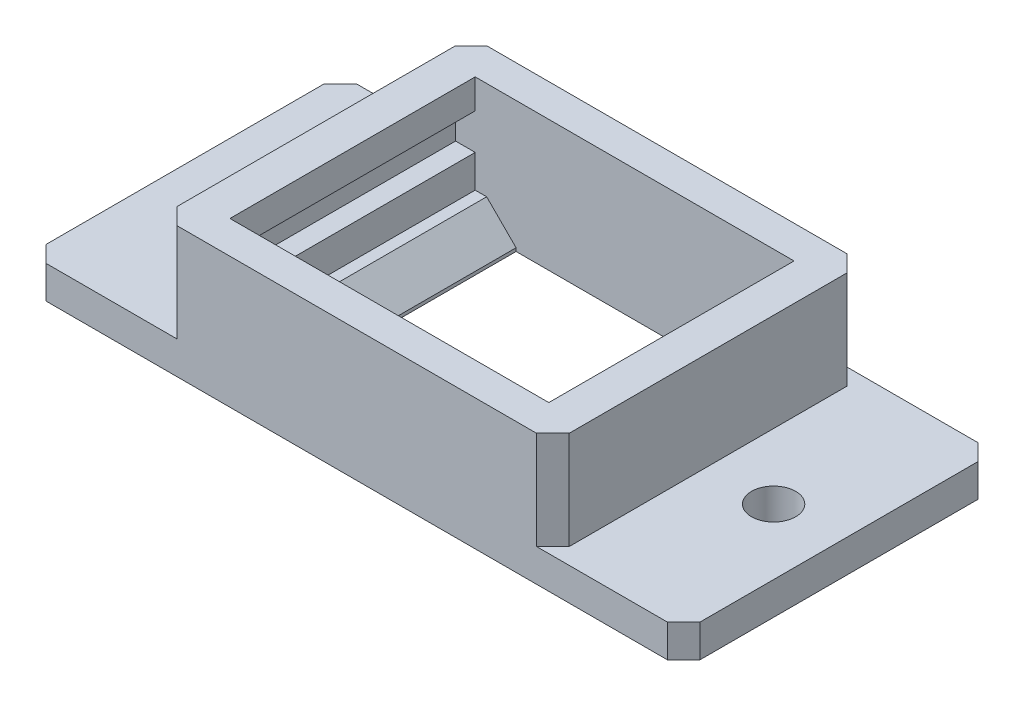
ISO-10303-21;
HEADER;
FILE_DESCRIPTION(('STEP AP214'),'2;1');
FILE_NAME('part.step','',(''),(''),'','','');
FILE_SCHEMA(('AUTOMOTIVE_DESIGN { 1 0 10303 214 1 1 1 1 }'));
ENDSEC;
DATA;
#1=APPLICATION_CONTEXT('core data for automotive mechanical design processes');
#2=APPLICATION_PROTOCOL_DEFINITION('international standard','automotive_design',2000,#1);
#3=PRODUCT_CONTEXT('',#1,'mechanical');
#4=PRODUCT('Part','Part','',(#3));
#5=PRODUCT_RELATED_PRODUCT_CATEGORY('part','',(#4));
#6=PRODUCT_DEFINITION_FORMATION('','',#4);
#7=PRODUCT_DEFINITION_CONTEXT('part definition',#1,'design');
#8=PRODUCT_DEFINITION('design','',#6,#7);
#9=PRODUCT_DEFINITION_SHAPE('','',#8);
#10=(LENGTH_UNIT() NAMED_UNIT(*) SI_UNIT(.MILLI.,.METRE.));
#11=(NAMED_UNIT(*) PLANE_ANGLE_UNIT() SI_UNIT($,.RADIAN.));
#12=(NAMED_UNIT(*) SI_UNIT($,.STERADIAN.) SOLID_ANGLE_UNIT());
#13=UNCERTAINTY_MEASURE_WITH_UNIT(LENGTH_MEASURE(1.E-05),#10,'distance_accuracy_value','');
#14=(GEOMETRIC_REPRESENTATION_CONTEXT(3) GLOBAL_UNCERTAINTY_ASSIGNED_CONTEXT((#13)) GLOBAL_UNIT_ASSIGNED_CONTEXT((#10,
#11,#12)) REPRESENTATION_CONTEXT('',''));
#15=CARTESIAN_POINT('',(0.,0.,0.));
#16=DIRECTION('',(0.,0.,1.));
#17=DIRECTION('',(1.,0.,0.));
#18=AXIS2_PLACEMENT_3D('',#15,#16,#17);
#19=CARTESIAN_POINT('',(9.75,2.,7.5));
#20=DIRECTION('',(1.,0.,0.));
#21=DIRECTION('',(0.,0.,-1.));
#22=AXIS2_PLACEMENT_3D('',#19,#20,#21);
#23=PLANE('',#22);
#24=DIRECTION('',(0.,0.,-1.));
#25=VECTOR('',#24,1.);
#26=CARTESIAN_POINT('',(9.75,4.,7.5));
#27=LINE('',#26,#25);
#28=CARTESIAN_POINT('',(9.75,4.,7.5));
#29=VERTEX_POINT('',#28);
#30=CARTESIAN_POINT('',(9.75,4.,-7.5));
#31=VERTEX_POINT('',#30);
#32=EDGE_CURVE('E260',#29,#31,#27,.T.);
#33=ORIENTED_EDGE('',*,*,#32,.T.);
#34=DIRECTION('',(0.,1.,0.));
#35=VECTOR('',#34,1.);
#36=CARTESIAN_POINT('',(9.75,2.,-7.5));
#37=LINE('',#36,#35);
#38=CARTESIAN_POINT('',(9.75,0.,-7.5));
#39=VERTEX_POINT('',#38);
#40=EDGE_CURVE('E461',#39,#31,#37,.T.);
#41=ORIENTED_EDGE('',*,*,#40,.F.);
#42=DIRECTION('',(0.,0.,-1.));
#43=VECTOR('',#42,1.);
#44=CARTESIAN_POINT('',(9.75,0.,0.));
#45=LINE('',#44,#43);
#46=CARTESIAN_POINT('',(9.75,0.,7.5));
#47=VERTEX_POINT('',#46);
#48=EDGE_CURVE('E319',#47,#39,#45,.T.);
#49=ORIENTED_EDGE('',*,*,#48,.F.);
#50=DIRECTION('',(0.,1.,0.));
#51=VECTOR('',#50,1.);
#52=CARTESIAN_POINT('',(9.75,2.,7.5));
#53=LINE('',#52,#51);
#54=EDGE_CURVE('E459',#47,#29,#53,.T.);
#55=ORIENTED_EDGE('',*,*,#54,.T.);
#56=EDGE_LOOP('',(#33,#41,#49,#55));
#57=FACE_BOUND('',#56,.T.);
#58=ADVANCED_FACE('F34',(#57),#23,.F.);
#59=DIRECTION('',(0.,0.,1.));
#60=VECTOR('',#59,1.);
#61=CARTESIAN_POINT('',(9.75,6.2,7.5));
#62=LINE('',#61,#60);
#63=CARTESIAN_POINT('',(9.75,6.2,-7.5));
#64=VERTEX_POINT('',#63);
#65=CARTESIAN_POINT('',(9.75,6.2,7.5));
#66=VERTEX_POINT('',#65);
#67=EDGE_CURVE('E263',#64,#66,#62,.T.);
#68=ORIENTED_EDGE('',*,*,#67,.T.);
#69=CARTESIAN_POINT('',(9.75,8.,7.5));
#70=VERTEX_POINT('',#69);
#71=EDGE_CURVE('E256',#66,#70,#53,.T.);
#72=ORIENTED_EDGE('',*,*,#71,.T.);
#73=DIRECTION('',(0.,0.,-1.));
#74=VECTOR('',#73,1.);
#75=CARTESIAN_POINT('',(9.75,8.,7.5));
#76=LINE('',#75,#74);
#77=CARTESIAN_POINT('',(9.75,8.,-7.5));
#78=VERTEX_POINT('',#77);
#79=EDGE_CURVE('E919',#70,#78,#76,.T.);
#80=ORIENTED_EDGE('',*,*,#79,.T.);
#81=EDGE_CURVE('E466',#64,#78,#37,.T.);
#82=ORIENTED_EDGE('',*,*,#81,.F.);
#83=EDGE_LOOP('',(#68,#72,#80,#82));
#84=FACE_BOUND('',#83,.T.);
#85=ADVANCED_FACE('F571',(#84),#23,.F.);
#86=CARTESIAN_POINT('',(-9.75,2.,7.5));
#87=DIRECTION('',(-1.,0.,0.));
#88=DIRECTION('',(0.,0.,1.));
#89=AXIS2_PLACEMENT_3D('',#86,#87,#88);
#90=PLANE('',#89);
#91=DIRECTION('',(0.,1.,0.));
#92=VECTOR('',#91,1.);
#93=CARTESIAN_POINT('',(-9.75,2.,7.5));
#94=LINE('',#93,#92);
#95=CARTESIAN_POINT('',(-9.75,6.2,7.5));
#96=VERTEX_POINT('',#95);
#97=CARTESIAN_POINT('',(-9.75,8.,7.5));
#98=VERTEX_POINT('',#97);
#99=EDGE_CURVE('E336',#96,#98,#94,.T.);
#100=ORIENTED_EDGE('',*,*,#99,.F.);
#101=DIRECTION('',(0.,0.,1.));
#102=VECTOR('',#101,1.);
#103=CARTESIAN_POINT('',(-9.75,6.2,7.5));
#104=LINE('',#103,#102);
#105=CARTESIAN_POINT('',(-9.75,6.2,-7.5));
#106=VERTEX_POINT('',#105);
#107=EDGE_CURVE('E283',#106,#96,#104,.T.);
#108=ORIENTED_EDGE('',*,*,#107,.F.);
#109=DIRECTION('',(0.,1.,0.));
#110=VECTOR('',#109,1.);
#111=CARTESIAN_POINT('',(-9.75,2.,-7.5));
#112=LINE('',#111,#110);
#113=CARTESIAN_POINT('',(-9.75,8.,-7.5));
#114=VERTEX_POINT('',#113);
#115=EDGE_CURVE('E465',#106,#114,#112,.T.);
#116=ORIENTED_EDGE('',*,*,#115,.T.);
#117=DIRECTION('',(0.,0.,1.));
#118=VECTOR('',#117,1.);
#119=CARTESIAN_POINT('',(-9.75,8.,7.5));
#120=LINE('',#119,#118);
#121=EDGE_CURVE('E328',#114,#98,#120,.T.);
#122=ORIENTED_EDGE('',*,*,#121,.T.);
#123=EDGE_LOOP('',(#100,#108,#116,#122));
#124=FACE_BOUND('',#123,.T.);
#125=ADVANCED_FACE('F576',(#124),#90,.F.);
#126=CARTESIAN_POINT('',(-20.,8.,9.50000000000001));
#127=DIRECTION('',(1.,0.,0.));
#128=DIRECTION('',(0.,0.,-1.));
#129=AXIS2_PLACEMENT_3D('',#126,#127,#128);
#130=PLANE('',#129);
#131=DIRECTION('',(0.,0.,1.));
#132=VECTOR('',#131,1.);
#133=CARTESIAN_POINT('',(-20.,0.,9.50000000000001));
#134=LINE('',#133,#132);
#135=CARTESIAN_POINT('',(-20.,0.,-8.49999999999998));
#136=VERTEX_POINT('',#135);
#137=CARTESIAN_POINT('',(-20.,0.,8.5));
#138=VERTEX_POINT('',#137);
#139=EDGE_CURVE('E415',#136,#138,#134,.T.);
#140=ORIENTED_EDGE('',*,*,#139,.T.);
#141=DIRECTION('',(0.,1.,0.));
#142=VECTOR('',#141,1.);
#143=CARTESIAN_POINT('',(-20.,8.,8.5));
#144=LINE('',#143,#142);
#145=CARTESIAN_POINT('',(-20.,2.,8.5));
#146=VERTEX_POINT('',#145);
#147=EDGE_CURVE('E49',#138,#146,#144,.T.);
#148=ORIENTED_EDGE('',*,*,#147,.T.);
#149=DIRECTION('',(0.,0.,1.));
#150=VECTOR('',#149,1.);
#151=CARTESIAN_POINT('',(-20.,2.,9.50000000000001));
#152=LINE('',#151,#150);
#153=CARTESIAN_POINT('',(-20.,2.,-8.49999999999998));
#154=VERTEX_POINT('',#153);
#155=EDGE_CURVE('E416',#154,#146,#152,.T.);
#156=ORIENTED_EDGE('',*,*,#155,.F.);
#157=DIRECTION('',(0.,-1.,0.));
#158=VECTOR('',#157,1.);
#159=CARTESIAN_POINT('',(-20.,8.,-8.49999999999999));
#160=LINE('',#159,#158);
#161=EDGE_CURVE('E409',#154,#136,#160,.T.);
#162=ORIENTED_EDGE('',*,*,#161,.T.);
#163=EDGE_LOOP('',(#140,#148,#156,#162));
#164=FACE_BOUND('',#163,.T.);
#165=ADVANCED_FACE('F414',(#164),#130,.F.);
#166=CARTESIAN_POINT('',(20.,8.,9.5));
#167=DIRECTION('',(0.,0.,-1.));
#168=DIRECTION('',(-1.,0.,0.));
#169=AXIS2_PLACEMENT_3D('',#166,#167,#168);
#170=PLANE('',#169);
#171=DIRECTION('',(1.,0.,0.));
#172=VECTOR('',#171,1.);
#173=CARTESIAN_POINT('',(20.,0.,9.5));
#174=LINE('',#173,#172);
#175=CARTESIAN_POINT('',(-19.,0.,9.50000000000001));
#176=VERTEX_POINT('',#175);
#177=CARTESIAN_POINT('',(19.,0.,9.5));
#178=VERTEX_POINT('',#177);
#179=EDGE_CURVE('E424',#176,#178,#174,.T.);
#180=ORIENTED_EDGE('',*,*,#179,.T.);
#181=DIRECTION('',(0.,1.,0.));
#182=VECTOR('',#181,1.);
#183=CARTESIAN_POINT('',(19.,8.,9.5));
#184=LINE('',#183,#182);
#185=CARTESIAN_POINT('',(19.,2.,9.5));
#186=VERTEX_POINT('',#185);
#187=EDGE_CURVE('E398',#178,#186,#184,.T.);
#188=ORIENTED_EDGE('',*,*,#187,.T.);
#189=DIRECTION('',(1.,0.,0.));
#190=VECTOR('',#189,1.);
#191=CARTESIAN_POINT('',(20.,2.,9.5));
#192=LINE('',#191,#190);
#193=CARTESIAN_POINT('',(11.,2.,9.5));
#194=VERTEX_POINT('',#193);
#195=EDGE_CURVE('E425',#194,#186,#192,.T.);
#196=ORIENTED_EDGE('',*,*,#195,.F.);
#197=DIRECTION('',(0.,1.,0.));
#198=VECTOR('',#197,1.);
#199=CARTESIAN_POINT('',(11.,8.,9.5));
#200=LINE('',#199,#198);
#201=CARTESIAN_POINT('',(11.,8.,9.5));
#202=VERTEX_POINT('',#201);
#203=EDGE_CURVE('E369',#194,#202,#200,.T.);
#204=ORIENTED_EDGE('',*,*,#203,.T.);
#205=DIRECTION('',(1.,0.,0.));
#206=VECTOR('',#205,1.);
#207=CARTESIAN_POINT('',(20.,8.,9.5));
#208=LINE('',#207,#206);
#209=CARTESIAN_POINT('',(-11.,8.,9.5));
#210=VERTEX_POINT('',#209);
#211=EDGE_CURVE('E442',#210,#202,#208,.T.);
#212=ORIENTED_EDGE('',*,*,#211,.F.);
#213=DIRECTION('',(0.,-1.,0.));
#214=VECTOR('',#213,1.);
#215=CARTESIAN_POINT('',(-11.,2.,9.5));
#216=LINE('',#215,#214);
#217=CARTESIAN_POINT('',(-11.,2.,9.5));
#218=VERTEX_POINT('',#217);
#219=EDGE_CURVE('E366',#210,#218,#216,.T.);
#220=ORIENTED_EDGE('',*,*,#219,.T.);
#221=CARTESIAN_POINT('',(-19.,2.,9.50000000000001));
#222=VERTEX_POINT('',#221);
#223=EDGE_CURVE('E433',#222,#218,#192,.T.);
#224=ORIENTED_EDGE('',*,*,#223,.F.);
#225=DIRECTION('',(0.,-1.,0.));
#226=VECTOR('',#225,1.);
#227=CARTESIAN_POINT('',(-19.,8.,9.50000000000001));
#228=LINE('',#227,#226);
#229=EDGE_CURVE('E395',#222,#176,#228,.T.);
#230=ORIENTED_EDGE('',*,*,#229,.T.);
#231=EDGE_LOOP('',(#180,#188,#196,#204,#212,#220,#224,#230));
#232=FACE_BOUND('',#231,.T.);
#233=ADVANCED_FACE('F542',(#232),#170,.F.);
#234=CARTESIAN_POINT('',(20.,8.,9.5));
#235=DIRECTION('',(-1.,0.,0.));
#236=DIRECTION('',(0.,0.,1.));
#237=AXIS2_PLACEMENT_3D('',#234,#235,#236);
#238=PLANE('',#237);
#239=DIRECTION('',(0.,0.,-1.));
#240=VECTOR('',#239,1.);
#241=CARTESIAN_POINT('',(20.,2.,9.5));
#242=LINE('',#241,#240);
#243=CARTESIAN_POINT('',(20.,2.,8.49999999999999));
#244=VERTEX_POINT('',#243);
#245=CARTESIAN_POINT('',(20.,2.,-8.49999999999999));
#246=VERTEX_POINT('',#245);
#247=EDGE_CURVE('E431',#244,#246,#242,.T.);
#248=ORIENTED_EDGE('',*,*,#247,.F.);
#249=DIRECTION('',(0.,-1.,0.));
#250=VECTOR('',#249,1.);
#251=CARTESIAN_POINT('',(20.,8.,8.49999999999999));
#252=LINE('',#251,#250);
#253=CARTESIAN_POINT('',(20.,0.,8.49999999999999));
#254=VERTEX_POINT('',#253);
#255=EDGE_CURVE('E384',#244,#254,#252,.T.);
#256=ORIENTED_EDGE('',*,*,#255,.T.);
#257=DIRECTION('',(0.,0.,-1.));
#258=VECTOR('',#257,1.);
#259=CARTESIAN_POINT('',(20.,0.,9.5));
#260=LINE('',#259,#258);
#261=CARTESIAN_POINT('',(20.,0.,-8.49999999999999));
#262=VERTEX_POINT('',#261);
#263=EDGE_CURVE('E428',#254,#262,#260,.T.);
#264=ORIENTED_EDGE('',*,*,#263,.T.);
#265=DIRECTION('',(0.,1.,0.));
#266=VECTOR('',#265,1.);
#267=CARTESIAN_POINT('',(20.,8.,-8.49999999999999));
#268=LINE('',#267,#266);
#269=EDGE_CURVE('E382',#262,#246,#268,.T.);
#270=ORIENTED_EDGE('',*,*,#269,.T.);
#271=EDGE_LOOP('',(#248,#256,#264,#270));
#272=FACE_BOUND('',#271,.T.);
#273=ADVANCED_FACE('F517',(#272),#238,.F.);
#274=CARTESIAN_POINT('',(20.,8.,-9.5));
#275=DIRECTION('',(0.,0.,1.));
#276=DIRECTION('',(1.,0.,0.));
#277=AXIS2_PLACEMENT_3D('',#274,#275,#276);
#278=PLANE('',#277);
#279=DIRECTION('',(-1.,0.,0.));
#280=VECTOR('',#279,1.);
#281=CARTESIAN_POINT('',(20.,2.,-9.5));
#282=LINE('',#281,#280);
#283=CARTESIAN_POINT('',(19.,2.,-9.5));
#284=VERTEX_POINT('',#283);
#285=CARTESIAN_POINT('',(11.,2.,-9.5));
#286=VERTEX_POINT('',#285);
#287=EDGE_CURVE('E443',#284,#286,#282,.T.);
#288=ORIENTED_EDGE('',*,*,#287,.F.);
#289=DIRECTION('',(0.,-1.,0.));
#290=VECTOR('',#289,1.);
#291=CARTESIAN_POINT('',(19.,8.,-9.5));
#292=LINE('',#291,#290);
#293=CARTESIAN_POINT('',(19.,0.,-9.5));
#294=VERTEX_POINT('',#293);
#295=EDGE_CURVE('E406',#284,#294,#292,.T.);
#296=ORIENTED_EDGE('',*,*,#295,.T.);
#297=DIRECTION('',(-1.,0.,0.));
#298=VECTOR('',#297,1.);
#299=CARTESIAN_POINT('',(20.,0.,-9.5));
#300=LINE('',#299,#298);
#301=CARTESIAN_POINT('',(-19.,0.,-9.49999999999999));
#302=VERTEX_POINT('',#301);
#303=EDGE_CURVE('E440',#294,#302,#300,.T.);
#304=ORIENTED_EDGE('',*,*,#303,.T.);
#305=DIRECTION('',(0.,1.,0.));
#306=VECTOR('',#305,1.);
#307=CARTESIAN_POINT('',(-19.,8.,-9.49999999999999));
#308=LINE('',#307,#306);
#309=CARTESIAN_POINT('',(-19.,2.,-9.5));
#310=VERTEX_POINT('',#309);
#311=EDGE_CURVE('E404',#302,#310,#308,.T.);
#312=ORIENTED_EDGE('',*,*,#311,.T.);
#313=CARTESIAN_POINT('',(-11.,2.,-9.5));
#314=VERTEX_POINT('',#313);
#315=EDGE_CURVE('E446',#314,#310,#282,.T.);
#316=ORIENTED_EDGE('',*,*,#315,.F.);
#317=DIRECTION('',(0.,1.,0.));
#318=VECTOR('',#317,1.);
#319=CARTESIAN_POINT('',(-11.,8.,-9.5));
#320=LINE('',#319,#318);
#321=CARTESIAN_POINT('',(-11.,8.,-9.49999999999999));
#322=VERTEX_POINT('',#321);
#323=EDGE_CURVE('E345',#314,#322,#320,.T.);
#324=ORIENTED_EDGE('',*,*,#323,.T.);
#325=DIRECTION('',(-1.,0.,0.));
#326=VECTOR('',#325,1.);
#327=CARTESIAN_POINT('',(20.,8.,-9.5));
#328=LINE('',#327,#326);
#329=CARTESIAN_POINT('',(11.,8.,-9.5));
#330=VERTEX_POINT('',#329);
#331=EDGE_CURVE('E435',#330,#322,#328,.T.);
#332=ORIENTED_EDGE('',*,*,#331,.F.);
#333=DIRECTION('',(0.,-1.,0.));
#334=VECTOR('',#333,1.);
#335=CARTESIAN_POINT('',(11.,2.,-9.5));
#336=LINE('',#335,#334);
#337=EDGE_CURVE('E342',#330,#286,#336,.T.);
#338=ORIENTED_EDGE('',*,*,#337,.T.);
#339=EDGE_LOOP('',(#288,#296,#304,#312,#316,#324,#332,#338));
#340=FACE_BOUND('',#339,.T.);
#341=ADVANCED_FACE('F511',(#340),#278,.F.);
#342=CARTESIAN_POINT('',(0.,8.,0.));
#343=DIRECTION('',(0.,1.,0.));
#344=DIRECTION('',(0.,0.,1.));
#345=AXIS2_PLACEMENT_3D('',#342,#343,#344);
#346=PLANE('',#345);
#347=ORIENTED_EDGE('',*,*,#121,.F.);
#348=DIRECTION('',(-1.,0.,0.));
#349=VECTOR('',#348,1.);
#350=CARTESIAN_POINT('',(9.75,8.,-7.5));
#351=LINE('',#350,#349);
#352=EDGE_CURVE('E309',#78,#114,#351,.T.);
#353=ORIENTED_EDGE('',*,*,#352,.F.);
#354=ORIENTED_EDGE('',*,*,#79,.F.);
#355=DIRECTION('',(1.,0.,0.));
#356=VECTOR('',#355,1.);
#357=CARTESIAN_POINT('',(9.75,8.,7.5));
#358=LINE('',#357,#356);
#359=EDGE_CURVE('E620',#98,#70,#358,.T.);
#360=ORIENTED_EDGE('',*,*,#359,.F.);
#361=EDGE_LOOP('',(#347,#353,#354,#360));
#362=FACE_BOUND('',#361,.T.);
#363=ORIENTED_EDGE('',*,*,#331,.T.);
#364=DIRECTION('',(-0.707106781186544,0.,0.707106781186551));
#365=VECTOR('',#364,1.);
#366=CARTESIAN_POINT('',(-10.2500000000001,8.,-10.25));
#367=LINE('',#366,#365);
#368=CARTESIAN_POINT('',(-12.,8.,-8.49999999999999));
#369=VERTEX_POINT('',#368);
#370=EDGE_CURVE('E354',#322,#369,#367,.T.);
#371=ORIENTED_EDGE('',*,*,#370,.T.);
#372=DIRECTION('',(0.,0.,1.));
#373=VECTOR('',#372,1.);
#374=CARTESIAN_POINT('',(-12.,8.,9.5));
#375=LINE('',#374,#373);
#376=CARTESIAN_POINT('',(-12.,8.,8.5));
#377=VERTEX_POINT('',#376);
#378=EDGE_CURVE('E491',#369,#377,#375,.T.);
#379=ORIENTED_EDGE('',*,*,#378,.T.);
#380=DIRECTION('',(0.707106781186548,0.,0.707106781186548));
#381=VECTOR('',#380,1.);
#382=CARTESIAN_POINT('',(-10.25,8.,10.25));
#383=LINE('',#382,#381);
#384=EDGE_CURVE('E348',#377,#210,#383,.T.);
#385=ORIENTED_EDGE('',*,*,#384,.T.);
#386=ORIENTED_EDGE('',*,*,#211,.T.);
#387=DIRECTION('',(0.707106781186548,0.,-0.707106781186548));
#388=VECTOR('',#387,1.);
#389=CARTESIAN_POINT('',(10.25,8.,10.25));
#390=LINE('',#389,#388);
#391=CARTESIAN_POINT('',(12.,8.,8.50000000000001));
#392=VERTEX_POINT('',#391);
#393=EDGE_CURVE('E350',#202,#392,#390,.T.);
#394=ORIENTED_EDGE('',*,*,#393,.T.);
#395=DIRECTION('',(0.,0.,-1.));
#396=VECTOR('',#395,1.);
#397=CARTESIAN_POINT('',(12.,8.,9.5));
#398=LINE('',#397,#396);
#399=CARTESIAN_POINT('',(12.,8.,-8.49999999999998));
#400=VERTEX_POINT('',#399);
#401=EDGE_CURVE('E488',#392,#400,#398,.T.);
#402=ORIENTED_EDGE('',*,*,#401,.T.);
#403=DIRECTION('',(-0.707106781186548,0.,-0.707106781186548));
#404=VECTOR('',#403,1.);
#405=CARTESIAN_POINT('',(10.25,8.,-10.25));
#406=LINE('',#405,#404);
#407=EDGE_CURVE('E352',#400,#330,#406,.T.);
#408=ORIENTED_EDGE('',*,*,#407,.T.);
#409=EDGE_LOOP('',(#363,#371,#379,#385,#386,#394,#402,#408));
#410=FACE_BOUND('',#409,.T.);
#411=ADVANCED_FACE('F557',(#362,#410),#346,.T.);
#412=CARTESIAN_POINT('',(0.,0.,0.));
#413=DIRECTION('',(0.,1.,0.));
#414=DIRECTION('',(0.,0.,1.));
#415=AXIS2_PLACEMENT_3D('',#412,#413,#414);
#416=PLANE('',#415);
#417=CARTESIAN_POINT('',(16.,0.,0.));
#418=DIRECTION('',(0.,1.,0.));
#419=DIRECTION('',(0.,0.,1.));
#420=AXIS2_PLACEMENT_3D('',#417,#418,#419);
#421=CIRCLE('',#420,1.35);
#422=CARTESIAN_POINT('',(16.,0.,1.35));
#423=VERTEX_POINT('',#422);
#424=EDGE_CURVE('E670',#423,#423,#421,.T.);
#425=ORIENTED_EDGE('',*,*,#424,.T.);
#426=EDGE_LOOP('',(#425));
#427=FACE_BOUND('',#426,.T.);
#428=CARTESIAN_POINT('',(-16.,0.,0.));
#429=DIRECTION('',(0.,1.,0.));
#430=DIRECTION('',(0.,0.,1.));
#431=AXIS2_PLACEMENT_3D('',#428,#429,#430);
#432=CIRCLE('',#431,1.35);
#433=CARTESIAN_POINT('',(-16.,0.,1.35));
#434=VERTEX_POINT('',#433);
#435=EDGE_CURVE('E271',#434,#434,#432,.T.);
#436=ORIENTED_EDGE('',*,*,#435,.T.);
#437=EDGE_LOOP('',(#436));
#438=FACE_BOUND('',#437,.T.);
#439=DIRECTION('',(1.,0.,0.));
#440=VECTOR('',#439,1.);
#441=CARTESIAN_POINT('',(0.,0.,7.5));
#442=LINE('',#441,#440);
#443=CARTESIAN_POINT('',(-7.25,0.,7.5));
#444=VERTEX_POINT('',#443);
#445=EDGE_CURVE('E451',#444,#47,#442,.T.);
#446=ORIENTED_EDGE('',*,*,#445,.T.);
#447=ORIENTED_EDGE('',*,*,#48,.T.);
#448=DIRECTION('',(-1.,0.,0.));
#449=VECTOR('',#448,1.);
#450=CARTESIAN_POINT('',(0.,0.,-7.5));
#451=LINE('',#450,#449);
#452=CARTESIAN_POINT('',(-7.25,0.,-7.5));
#453=VERTEX_POINT('',#452);
#454=EDGE_CURVE('E445',#39,#453,#451,.T.);
#455=ORIENTED_EDGE('',*,*,#454,.T.);
#456=DIRECTION('',(0.,0.,1.));
#457=VECTOR('',#456,1.);
#458=CARTESIAN_POINT('',(-7.25,0.,0.));
#459=LINE('',#458,#457);
#460=EDGE_CURVE('E449',#453,#444,#459,.T.);
#461=ORIENTED_EDGE('',*,*,#460,.T.);
#462=EDGE_LOOP('',(#446,#447,#455,#461));
#463=FACE_BOUND('',#462,.T.);
#464=ORIENTED_EDGE('',*,*,#263,.F.);
#465=DIRECTION('',(0.707106781186548,0.,-0.707106781186548));
#466=VECTOR('',#465,1.);
#467=CARTESIAN_POINT('',(20.,0.,8.49999999999999));
#468=LINE('',#467,#466);
#469=EDGE_CURVE('E393',#254,#178,#468,.F.);
#470=ORIENTED_EDGE('',*,*,#469,.T.);
#471=ORIENTED_EDGE('',*,*,#179,.F.);
#472=DIRECTION('',(0.707106781186548,0.,0.707106781186548));
#473=VECTOR('',#472,1.);
#474=CARTESIAN_POINT('',(-19.,0.,9.50000000000001));
#475=LINE('',#474,#473);
#476=EDGE_CURVE('E389',#176,#138,#475,.F.);
#477=ORIENTED_EDGE('',*,*,#476,.T.);
#478=ORIENTED_EDGE('',*,*,#139,.F.);
#479=DIRECTION('',(-0.707106781186548,0.,0.707106781186548));
#480=VECTOR('',#479,1.);
#481=CARTESIAN_POINT('',(-20.,0.,-8.49999999999999));
#482=LINE('',#481,#480);
#483=EDGE_CURVE('E387',#136,#302,#482,.F.);
#484=ORIENTED_EDGE('',*,*,#483,.T.);
#485=ORIENTED_EDGE('',*,*,#303,.F.);
#486=DIRECTION('',(-0.707106781186548,0.,-0.707106781186548));
#487=VECTOR('',#486,1.);
#488=CARTESIAN_POINT('',(19.,0.,-9.5));
#489=LINE('',#488,#487);
#490=EDGE_CURVE('E391',#294,#262,#489,.F.);
#491=ORIENTED_EDGE('',*,*,#490,.T.);
#492=EDGE_LOOP('',(#464,#470,#471,#477,#478,#484,#485,#491));
#493=FACE_BOUND('',#492,.T.);
#494=ADVANCED_FACE('F420',(#427,#438,#463,#493),#416,.F.);
#495=CARTESIAN_POINT('',(12.,2.,9.5));
#496=DIRECTION('',(1.,0.,0.));
#497=DIRECTION('',(0.,0.,-1.));
#498=AXIS2_PLACEMENT_3D('',#495,#496,#497);
#499=PLANE('',#498);
#500=DIRECTION('',(0.,0.,-1.));
#501=VECTOR('',#500,1.);
#502=CARTESIAN_POINT('',(12.,2.,9.5));
#503=LINE('',#502,#501);
#504=CARTESIAN_POINT('',(12.,2.,8.50000000000001));
#505=VERTEX_POINT('',#504);
#506=CARTESIAN_POINT('',(12.,2.,-8.49999999999999));
#507=VERTEX_POINT('',#506);
#508=EDGE_CURVE('E487',#505,#507,#503,.T.);
#509=ORIENTED_EDGE('',*,*,#508,.T.);
#510=DIRECTION('',(0.,1.,0.));
#511=VECTOR('',#510,1.);
#512=CARTESIAN_POINT('',(12.,8.,-8.49999999999999));
#513=LINE('',#512,#511);
#514=EDGE_CURVE('E363',#507,#400,#513,.T.);
#515=ORIENTED_EDGE('',*,*,#514,.T.);
#516=ORIENTED_EDGE('',*,*,#401,.F.);
#517=DIRECTION('',(0.,-1.,0.));
#518=VECTOR('',#517,1.);
#519=CARTESIAN_POINT('',(12.,2.,8.50000000000001));
#520=LINE('',#519,#518);
#521=EDGE_CURVE('E361',#392,#505,#520,.T.);
#522=ORIENTED_EDGE('',*,*,#521,.T.);
#523=EDGE_LOOP('',(#509,#515,#516,#522));
#524=FACE_BOUND('',#523,.T.);
#525=ADVANCED_FACE('F531',(#524),#499,.T.);
#526=CARTESIAN_POINT('',(0.,2.,0.));
#527=DIRECTION('',(0.,1.,0.));
#528=DIRECTION('',(0.,0.,1.));
#529=AXIS2_PLACEMENT_3D('',#526,#527,#528);
#530=PLANE('',#529);
#531=CARTESIAN_POINT('',(16.,2.,0.));
#532=DIRECTION('',(0.,1.,0.));
#533=DIRECTION('',(0.,0.,1.));
#534=AXIS2_PLACEMENT_3D('',#531,#532,#533);
#535=CIRCLE('',#534,1.35);
#536=CARTESIAN_POINT('',(16.,2.,1.35));
#537=VERTEX_POINT('',#536);
#538=EDGE_CURVE('E673',#537,#537,#535,.T.);
#539=ORIENTED_EDGE('',*,*,#538,.F.);
#540=EDGE_LOOP('',(#539));
#541=FACE_BOUND('',#540,.T.);
#542=ORIENTED_EDGE('',*,*,#195,.T.);
#543=DIRECTION('',(-0.707106781186548,0.,0.707106781186548));
#544=VECTOR('',#543,1.);
#545=CARTESIAN_POINT('',(14.25,2.,14.25));
#546=LINE('',#545,#544);
#547=EDGE_CURVE('E402',#186,#244,#546,.F.);
#548=ORIENTED_EDGE('',*,*,#547,.T.);
#549=ORIENTED_EDGE('',*,*,#247,.T.);
#550=DIRECTION('',(0.707106781186548,0.,0.707106781186548));
#551=VECTOR('',#550,1.);
#552=CARTESIAN_POINT('',(14.25,2.,-14.25));
#553=LINE('',#552,#551);
#554=EDGE_CURVE('E400',#246,#284,#553,.F.);
#555=ORIENTED_EDGE('',*,*,#554,.T.);
#556=ORIENTED_EDGE('',*,*,#287,.T.);
#557=DIRECTION('',(0.707106781186548,0.,0.707106781186548));
#558=VECTOR('',#557,1.);
#559=CARTESIAN_POINT('',(12.,2.,-8.49999999999999));
#560=LINE('',#559,#558);
#561=EDGE_CURVE('E375',#286,#507,#560,.T.);
#562=ORIENTED_EDGE('',*,*,#561,.T.);
#563=ORIENTED_EDGE('',*,*,#508,.F.);
#564=DIRECTION('',(-0.707106781186548,0.,0.707106781186548));
#565=VECTOR('',#564,1.);
#566=CARTESIAN_POINT('',(11.,2.,9.5));
#567=LINE('',#566,#565);
#568=EDGE_CURVE('E377',#505,#194,#567,.T.);
#569=ORIENTED_EDGE('',*,*,#568,.T.);
#570=EDGE_LOOP('',(#542,#548,#549,#555,#556,#562,#563,#569));
#571=FACE_BOUND('',#570,.T.);
#572=ADVANCED_FACE('F522',(#541,#571),#530,.T.);
#573=CARTESIAN_POINT('',(-16.,2.,0.));
#574=DIRECTION('',(0.,1.,0.));
#575=DIRECTION('',(0.,0.,1.));
#576=AXIS2_PLACEMENT_3D('',#573,#574,#575);
#577=CIRCLE('',#576,1.35);
#578=CARTESIAN_POINT('',(-16.,2.,1.35));
#579=VERTEX_POINT('',#578);
#580=EDGE_CURVE('E266',#579,#579,#577,.T.);
#581=ORIENTED_EDGE('',*,*,#580,.F.);
#582=EDGE_LOOP('',(#581));
#583=FACE_BOUND('',#582,.T.);
#584=ORIENTED_EDGE('',*,*,#155,.T.);
#585=DIRECTION('',(-0.707106781186548,0.,-0.707106781186548));
#586=VECTOR('',#585,1.);
#587=CARTESIAN_POINT('',(-14.25,2.,14.25));
#588=LINE('',#587,#586);
#589=EDGE_CURVE('E11',#146,#222,#588,.F.);
#590=ORIENTED_EDGE('',*,*,#589,.T.);
#591=ORIENTED_EDGE('',*,*,#223,.T.);
#592=DIRECTION('',(-0.707106781186548,0.,-0.707106781186548));
#593=VECTOR('',#592,1.);
#594=CARTESIAN_POINT('',(-12.,2.,8.5));
#595=LINE('',#594,#593);
#596=CARTESIAN_POINT('',(-12.,2.,8.5));
#597=VERTEX_POINT('',#596);
#598=EDGE_CURVE('E380',#218,#597,#595,.T.);
#599=ORIENTED_EDGE('',*,*,#598,.T.);
#600=DIRECTION('',(0.,0.,1.));
#601=VECTOR('',#600,1.);
#602=CARTESIAN_POINT('',(-12.,2.,9.5));
#603=LINE('',#602,#601);
#604=CARTESIAN_POINT('',(-12.,2.,-8.49999999999999));
#605=VERTEX_POINT('',#604);
#606=EDGE_CURVE('E484',#605,#597,#603,.T.);
#607=ORIENTED_EDGE('',*,*,#606,.F.);
#608=DIRECTION('',(0.707106781186544,0.,-0.707106781186551));
#609=VECTOR('',#608,1.);
#610=CARTESIAN_POINT('',(-11.,2.,-9.5));
#611=LINE('',#610,#609);
#612=EDGE_CURVE('E372',#605,#314,#611,.T.);
#613=ORIENTED_EDGE('',*,*,#612,.T.);
#614=ORIENTED_EDGE('',*,*,#315,.T.);
#615=DIRECTION('',(0.707106781186548,0.,-0.707106781186548));
#616=VECTOR('',#615,1.);
#617=CARTESIAN_POINT('',(-14.25,2.,-14.25));
#618=LINE('',#617,#616);
#619=EDGE_CURVE('E42',#310,#154,#618,.F.);
#620=ORIENTED_EDGE('',*,*,#619,.T.);
#621=EDGE_LOOP('',(#584,#590,#591,#599,#607,#613,#614,#620));
#622=FACE_BOUND('',#621,.T.);
#623=ADVANCED_FACE('F504',(#583,#622),#530,.T.);
#624=CARTESIAN_POINT('',(-12.,2.,9.5));
#625=DIRECTION('',(-1.,0.,0.));
#626=DIRECTION('',(0.,0.,1.));
#627=AXIS2_PLACEMENT_3D('',#624,#625,#626);
#628=PLANE('',#627);
#629=ORIENTED_EDGE('',*,*,#378,.F.);
#630=DIRECTION('',(0.,-1.,0.));
#631=VECTOR('',#630,1.);
#632=CARTESIAN_POINT('',(-12.,2.,-8.49999999999999));
#633=LINE('',#632,#631);
#634=EDGE_CURVE('E359',#369,#605,#633,.T.);
#635=ORIENTED_EDGE('',*,*,#634,.T.);
#636=ORIENTED_EDGE('',*,*,#606,.T.);
#637=DIRECTION('',(0.,1.,0.));
#638=VECTOR('',#637,1.);
#639=CARTESIAN_POINT('',(-12.,8.,8.5));
#640=LINE('',#639,#638);
#641=EDGE_CURVE('E356',#597,#377,#640,.T.);
#642=ORIENTED_EDGE('',*,*,#641,.T.);
#643=EDGE_LOOP('',(#629,#635,#636,#642));
#644=FACE_BOUND('',#643,.T.);
#645=ADVANCED_FACE('F555',(#644),#628,.T.);
#646=CARTESIAN_POINT('',(-9.75,2.,-7.5));
#647=VERTEX_POINT('',#646);
#648=CARTESIAN_POINT('',(-9.75,4.,-7.5));
#649=VERTEX_POINT('',#648);
#650=EDGE_CURVE('E494',#647,#649,#112,.T.);
#651=ORIENTED_EDGE('',*,*,#650,.T.);
#652=DIRECTION('',(0.,0.,-1.));
#653=VECTOR('',#652,1.);
#654=CARTESIAN_POINT('',(-9.75,4.,7.5));
#655=LINE('',#654,#653);
#656=CARTESIAN_POINT('',(-9.75,4.,7.5));
#657=VERTEX_POINT('',#656);
#658=EDGE_CURVE('E275',#657,#649,#655,.T.);
#659=ORIENTED_EDGE('',*,*,#658,.F.);
#660=CARTESIAN_POINT('',(-9.75,2.,7.5));
#661=VERTEX_POINT('',#660);
#662=EDGE_CURVE('E479',#661,#657,#94,.T.);
#663=ORIENTED_EDGE('',*,*,#662,.F.);
#664=DIRECTION('',(0.,0.,1.));
#665=VECTOR('',#664,1.);
#666=CARTESIAN_POINT('',(-9.75,2.,7.5));
#667=LINE('',#666,#665);
#668=EDGE_CURVE('E305',#647,#661,#667,.T.);
#669=ORIENTED_EDGE('',*,*,#668,.F.);
#670=EDGE_LOOP('',(#651,#659,#663,#669));
#671=FACE_BOUND('',#670,.T.);
#672=ADVANCED_FACE('F584',(#671),#90,.F.);
#673=CARTESIAN_POINT('',(9.75,2.,-7.5));
#674=DIRECTION('',(0.,0.,-1.));
#675=DIRECTION('',(-1.,0.,0.));
#676=AXIS2_PLACEMENT_3D('',#673,#674,#675);
#677=PLANE('',#676);
#678=ORIENTED_EDGE('',*,*,#352,.T.);
#679=ORIENTED_EDGE('',*,*,#115,.F.);
#680=DIRECTION('',(1.,0.,0.));
#681=VECTOR('',#680,1.);
#682=CARTESIAN_POINT('',(-10.95,6.2,-7.5));
#683=LINE('',#682,#681);
#684=CARTESIAN_POINT('',(-10.95,6.2,-7.5));
#685=VERTEX_POINT('',#684);
#686=EDGE_CURVE('E300',#685,#106,#683,.T.);
#687=ORIENTED_EDGE('',*,*,#686,.F.);
#688=DIRECTION('',(0.,1.,0.));
#689=VECTOR('',#688,1.);
#690=CARTESIAN_POINT('',(-10.95,6.2,-7.5));
#691=LINE('',#690,#689);
#692=CARTESIAN_POINT('',(-10.95,4.,-7.5));
#693=VERTEX_POINT('',#692);
#694=EDGE_CURVE('E286',#693,#685,#691,.T.);
#695=ORIENTED_EDGE('',*,*,#694,.F.);
#696=DIRECTION('',(1.,0.,0.));
#697=VECTOR('',#696,1.);
#698=CARTESIAN_POINT('',(-10.95,4.,-7.5));
#699=LINE('',#698,#697);
#700=EDGE_CURVE('E302',#693,#649,#699,.T.);
#701=ORIENTED_EDGE('',*,*,#700,.T.);
#702=ORIENTED_EDGE('',*,*,#650,.F.);
#703=DIRECTION('',(-1.,0.,0.));
#704=VECTOR('',#703,1.);
#705=CARTESIAN_POINT('',(9.75,2.,-7.5));
#706=LINE('',#705,#704);
#707=CARTESIAN_POINT('',(-9.05000000000002,2.,-7.5));
#708=VERTEX_POINT('',#707);
#709=EDGE_CURVE('E318',#708,#647,#706,.T.);
#710=ORIENTED_EDGE('',*,*,#709,.F.);
#711=DIRECTION('',(0.707106781186549,-0.707106781186546,0.));
#712=VECTOR('',#711,1.);
#713=CARTESIAN_POINT('',(0.35000000000002,-7.40000000000001,-7.5));
#714=LINE('',#713,#712);
#715=CARTESIAN_POINT('',(-7.25,0.19999999999999,-7.5));
#716=VERTEX_POINT('',#715);
#717=EDGE_CURVE('E340',#708,#716,#714,.T.);
#718=ORIENTED_EDGE('',*,*,#717,.T.);
#719=DIRECTION('',(0.,1.,0.));
#720=VECTOR('',#719,1.);
#721=CARTESIAN_POINT('',(-7.25,-6.,-7.5));
#722=LINE('',#721,#720);
#723=EDGE_CURVE('E299',#453,#716,#722,.T.);
#724=ORIENTED_EDGE('',*,*,#723,.F.);
#725=ORIENTED_EDGE('',*,*,#454,.F.);
#726=ORIENTED_EDGE('',*,*,#40,.T.);
#727=DIRECTION('',(-1.,0.,0.));
#728=VECTOR('',#727,1.);
#729=CARTESIAN_POINT('',(10.95,4.,-7.5));
#730=LINE('',#729,#728);
#731=CARTESIAN_POINT('',(10.95,4.,-7.5));
#732=VERTEX_POINT('',#731);
#733=EDGE_CURVE('E276',#732,#31,#730,.T.);
#734=ORIENTED_EDGE('',*,*,#733,.F.);
#735=DIRECTION('',(0.,1.,0.));
#736=VECTOR('',#735,1.);
#737=CARTESIAN_POINT('',(10.95,6.2,-7.5));
#738=LINE('',#737,#736);
#739=CARTESIAN_POINT('',(10.95,6.2,-7.5));
#740=VERTEX_POINT('',#739);
#741=EDGE_CURVE('E247',#732,#740,#738,.T.);
#742=ORIENTED_EDGE('',*,*,#741,.T.);
#743=DIRECTION('',(-1.,0.,0.));
#744=VECTOR('',#743,1.);
#745=CARTESIAN_POINT('',(10.95,6.2,-7.5));
#746=LINE('',#745,#744);
#747=EDGE_CURVE('E243',#740,#64,#746,.T.);
#748=ORIENTED_EDGE('',*,*,#747,.T.);
#749=ORIENTED_EDGE('',*,*,#81,.T.);
#750=EDGE_LOOP('',(#678,#679,#687,#695,#701,#702,#710,#718,#724,#725,#726,#734,#742,#748,#749));
#751=FACE_BOUND('',#750,.T.);
#752=ADVANCED_FACE('F469',(#751),#677,.F.);
#753=CARTESIAN_POINT('',(9.75,2.,7.5));
#754=DIRECTION('',(0.,0.,1.));
#755=DIRECTION('',(1.,0.,0.));
#756=AXIS2_PLACEMENT_3D('',#753,#754,#755);
#757=PLANE('',#756);
#758=ORIENTED_EDGE('',*,*,#359,.T.);
#759=ORIENTED_EDGE('',*,*,#71,.F.);
#760=DIRECTION('',(-1.,0.,0.));
#761=VECTOR('',#760,1.);
#762=CARTESIAN_POINT('',(10.95,6.2,7.5));
#763=LINE('',#762,#761);
#764=CARTESIAN_POINT('',(10.95,6.2,7.5));
#765=VERTEX_POINT('',#764);
#766=EDGE_CURVE('E241',#765,#66,#763,.T.);
#767=ORIENTED_EDGE('',*,*,#766,.F.);
#768=DIRECTION('',(0.,-1.,0.));
#769=VECTOR('',#768,1.);
#770=CARTESIAN_POINT('',(10.95,6.2,7.5));
#771=LINE('',#770,#769);
#772=CARTESIAN_POINT('',(10.95,4.,7.5));
#773=VERTEX_POINT('',#772);
#774=EDGE_CURVE('E248',#765,#773,#771,.T.);
#775=ORIENTED_EDGE('',*,*,#774,.T.);
#776=DIRECTION('',(-1.,0.,0.));
#777=VECTOR('',#776,1.);
#778=CARTESIAN_POINT('',(10.95,4.,7.5));
#779=LINE('',#778,#777);
#780=EDGE_CURVE('E273',#773,#29,#779,.T.);
#781=ORIENTED_EDGE('',*,*,#780,.T.);
#782=ORIENTED_EDGE('',*,*,#54,.F.);
#783=ORIENTED_EDGE('',*,*,#445,.F.);
#784=DIRECTION('',(0.,1.,0.));
#785=VECTOR('',#784,1.);
#786=CARTESIAN_POINT('',(-7.25,-6.,7.5));
#787=LINE('',#786,#785);
#788=CARTESIAN_POINT('',(-7.25,0.19999999999999,7.5));
#789=VERTEX_POINT('',#788);
#790=EDGE_CURVE('E323',#444,#789,#787,.T.);
#791=ORIENTED_EDGE('',*,*,#790,.T.);
#792=DIRECTION('',(-0.707106781186549,0.707106781186546,0.));
#793=VECTOR('',#792,1.);
#794=CARTESIAN_POINT('',(0.350000000000022,-7.40000000000001,7.5));
#795=LINE('',#794,#793);
#796=CARTESIAN_POINT('',(-9.05000000000002,2.,7.5));
#797=VERTEX_POINT('',#796);
#798=EDGE_CURVE('E338',#789,#797,#795,.T.);
#799=ORIENTED_EDGE('',*,*,#798,.T.);
#800=DIRECTION('',(1.,0.,0.));
#801=VECTOR('',#800,1.);
#802=CARTESIAN_POINT('',(9.75,2.,7.5));
#803=LINE('',#802,#801);
#804=EDGE_CURVE('E308',#661,#797,#803,.T.);
#805=ORIENTED_EDGE('',*,*,#804,.F.);
#806=ORIENTED_EDGE('',*,*,#662,.T.);
#807=DIRECTION('',(1.,0.,0.));
#808=VECTOR('',#807,1.);
#809=CARTESIAN_POINT('',(-10.95,4.,7.5));
#810=LINE('',#809,#808);
#811=CARTESIAN_POINT('',(-10.95,4.,7.5));
#812=VERTEX_POINT('',#811);
#813=EDGE_CURVE('E292',#812,#657,#810,.T.);
#814=ORIENTED_EDGE('',*,*,#813,.F.);
#815=DIRECTION('',(0.,-1.,0.));
#816=VECTOR('',#815,1.);
#817=CARTESIAN_POINT('',(-10.95,6.2,7.5));
#818=LINE('',#817,#816);
#819=CARTESIAN_POINT('',(-10.95,6.2,7.5));
#820=VERTEX_POINT('',#819);
#821=EDGE_CURVE('E279',#820,#812,#818,.T.);
#822=ORIENTED_EDGE('',*,*,#821,.F.);
#823=DIRECTION('',(1.,0.,0.));
#824=VECTOR('',#823,1.);
#825=CARTESIAN_POINT('',(-10.95,6.2,7.5));
#826=LINE('',#825,#824);
#827=EDGE_CURVE('E296',#820,#96,#826,.T.);
#828=ORIENTED_EDGE('',*,*,#827,.T.);
#829=ORIENTED_EDGE('',*,*,#99,.T.);
#830=EDGE_LOOP('',(#758,#759,#767,#775,#781,#782,#783,#791,#799,#805,#806,#814,#822,#828,#829));
#831=FACE_BOUND('',#830,.T.);
#832=ADVANCED_FACE('F254',(#831),#757,.F.);
#833=CARTESIAN_POINT('',(0.,2.,0.));
#834=DIRECTION('',(0.,1.,0.));
#835=DIRECTION('',(0.,0.,1.));
#836=AXIS2_PLACEMENT_3D('',#833,#834,#835);
#837=PLANE('',#836);
#838=ORIENTED_EDGE('',*,*,#804,.T.);
#839=DIRECTION('',(0.,0.,-1.));
#840=VECTOR('',#839,1.);
#841=CARTESIAN_POINT('',(-9.05000000000002,2.,-7.5));
#842=LINE('',#841,#840);
#843=EDGE_CURVE('E334',#797,#708,#842,.T.);
#844=ORIENTED_EDGE('',*,*,#843,.T.);
#845=ORIENTED_EDGE('',*,*,#709,.T.);
#846=ORIENTED_EDGE('',*,*,#668,.T.);
#847=EDGE_LOOP('',(#838,#844,#845,#846));
#848=FACE_BOUND('',#847,.T.);
#849=ADVANCED_FACE('F583',(#848),#837,.T.);
#850=CARTESIAN_POINT('',(-7.25,-6.,-7.5));
#851=DIRECTION('',(-1.,0.,0.));
#852=DIRECTION('',(0.,0.,1.));
#853=AXIS2_PLACEMENT_3D('',#850,#851,#852);
#854=PLANE('',#853);
#855=ORIENTED_EDGE('',*,*,#723,.T.);
#856=DIRECTION('',(0.,0.,1.));
#857=VECTOR('',#856,1.);
#858=CARTESIAN_POINT('',(-7.25,0.19999999999999,7.5));
#859=LINE('',#858,#857);
#860=EDGE_CURVE('E331',#716,#789,#859,.T.);
#861=ORIENTED_EDGE('',*,*,#860,.T.);
#862=ORIENTED_EDGE('',*,*,#790,.F.);
#863=ORIENTED_EDGE('',*,*,#460,.F.);
#864=EDGE_LOOP('',(#855,#861,#862,#863));
#865=FACE_BOUND('',#864,.T.);
#866=ADVANCED_FACE('F476',(#865),#854,.F.);
#867=CARTESIAN_POINT('',(-10.95,6.2,7.5));
#868=DIRECTION('',(0.,1.,0.));
#869=DIRECTION('',(0.,0.,1.));
#870=AXIS2_PLACEMENT_3D('',#867,#868,#869);
#871=PLANE('',#870);
#872=ORIENTED_EDGE('',*,*,#107,.T.);
#873=ORIENTED_EDGE('',*,*,#827,.F.);
#874=DIRECTION('',(0.,0.,1.));
#875=VECTOR('',#874,1.);
#876=CARTESIAN_POINT('',(-10.95,6.2,7.5));
#877=LINE('',#876,#875);
#878=EDGE_CURVE('E289',#685,#820,#877,.T.);
#879=ORIENTED_EDGE('',*,*,#878,.F.);
#880=ORIENTED_EDGE('',*,*,#686,.T.);
#881=EDGE_LOOP('',(#872,#873,#879,#880));
#882=FACE_BOUND('',#881,.T.);
#883=ADVANCED_FACE('F625',(#882),#871,.F.);
#884=CARTESIAN_POINT('',(-10.95,4.,7.5));
#885=DIRECTION('',(0.,-1.,0.));
#886=DIRECTION('',(0.,0.,-1.));
#887=AXIS2_PLACEMENT_3D('',#884,#885,#886);
#888=PLANE('',#887);
#889=ORIENTED_EDGE('',*,*,#658,.T.);
#890=ORIENTED_EDGE('',*,*,#700,.F.);
#891=DIRECTION('',(0.,0.,-1.));
#892=VECTOR('',#891,1.);
#893=CARTESIAN_POINT('',(-10.95,4.,7.5));
#894=LINE('',#893,#892);
#895=EDGE_CURVE('E282',#812,#693,#894,.T.);
#896=ORIENTED_EDGE('',*,*,#895,.F.);
#897=ORIENTED_EDGE('',*,*,#813,.T.);
#898=EDGE_LOOP('',(#889,#890,#896,#897));
#899=FACE_BOUND('',#898,.T.);
#900=ADVANCED_FACE('F631',(#899),#888,.F.);
#901=CARTESIAN_POINT('',(-10.95,0.,0.));
#902=DIRECTION('',(1.,0.,0.));
#903=DIRECTION('',(0.,0.,-1.));
#904=AXIS2_PLACEMENT_3D('',#901,#902,#903);
#905=PLANE('',#904);
#906=ORIENTED_EDGE('',*,*,#821,.T.);
#907=ORIENTED_EDGE('',*,*,#895,.T.);
#908=ORIENTED_EDGE('',*,*,#694,.T.);
#909=ORIENTED_EDGE('',*,*,#878,.T.);
#910=EDGE_LOOP('',(#906,#907,#908,#909));
#911=FACE_BOUND('',#910,.T.);
#912=ADVANCED_FACE('F628',(#911),#905,.T.);
#913=CARTESIAN_POINT('',(10.95,4.,7.5));
#914=DIRECTION('',(0.,1.,0.));
#915=DIRECTION('',(0.,0.,1.));
#916=AXIS2_PLACEMENT_3D('',#913,#914,#915);
#917=PLANE('',#916);
#918=ORIENTED_EDGE('',*,*,#32,.F.);
#919=ORIENTED_EDGE('',*,*,#780,.F.);
#920=DIRECTION('',(0.,0.,-1.));
#921=VECTOR('',#920,1.);
#922=CARTESIAN_POINT('',(10.95,4.,7.5));
#923=LINE('',#922,#921);
#924=EDGE_CURVE('E257',#773,#732,#923,.T.);
#925=ORIENTED_EDGE('',*,*,#924,.T.);
#926=ORIENTED_EDGE('',*,*,#733,.T.);
#927=EDGE_LOOP('',(#918,#919,#925,#926));
#928=FACE_BOUND('',#927,.T.);
#929=ADVANCED_FACE('F650',(#928),#917,.T.);
#930=CARTESIAN_POINT('',(10.95,6.2,7.5));
#931=DIRECTION('',(0.,-1.,0.));
#932=DIRECTION('',(0.,0.,-1.));
#933=AXIS2_PLACEMENT_3D('',#930,#931,#932);
#934=PLANE('',#933);
#935=ORIENTED_EDGE('',*,*,#67,.F.);
#936=ORIENTED_EDGE('',*,*,#747,.F.);
#937=DIRECTION('',(0.,0.,1.));
#938=VECTOR('',#937,1.);
#939=CARTESIAN_POINT('',(10.95,6.2,7.5));
#940=LINE('',#939,#938);
#941=EDGE_CURVE('E237',#740,#765,#940,.T.);
#942=ORIENTED_EDGE('',*,*,#941,.T.);
#943=ORIENTED_EDGE('',*,*,#766,.T.);
#944=EDGE_LOOP('',(#935,#936,#942,#943));
#945=FACE_BOUND('',#944,.T.);
#946=ADVANCED_FACE('F240',(#945),#934,.T.);
#947=CARTESIAN_POINT('',(10.95,0.,0.));
#948=DIRECTION('',(-1.,0.,0.));
#949=DIRECTION('',(0.,0.,-1.));
#950=AXIS2_PLACEMENT_3D('',#947,#948,#949);
#951=PLANE('',#950);
#952=ORIENTED_EDGE('',*,*,#774,.F.);
#953=ORIENTED_EDGE('',*,*,#941,.F.);
#954=ORIENTED_EDGE('',*,*,#741,.F.);
#955=ORIENTED_EDGE('',*,*,#924,.F.);
#956=EDGE_LOOP('',(#952,#953,#954,#955));
#957=FACE_BOUND('',#956,.T.);
#958=ADVANCED_FACE('F259',(#957),#951,.T.);
#959=CARTESIAN_POINT('',(-7.25,0.19999999999999,-7.5));
#960=DIRECTION('',(0.707106781186546,0.707106781186549,0.));
#961=DIRECTION('',(0.,0.,-1.));
#962=AXIS2_PLACEMENT_3D('',#959,#960,#961);
#963=PLANE('',#962);
#964=ORIENTED_EDGE('',*,*,#717,.F.);
#965=ORIENTED_EDGE('',*,*,#843,.F.);
#966=ORIENTED_EDGE('',*,*,#798,.F.);
#967=ORIENTED_EDGE('',*,*,#860,.F.);
#968=EDGE_LOOP('',(#964,#965,#966,#967));
#969=FACE_BOUND('',#968,.T.);
#970=ADVANCED_FACE('F561',(#969),#963,.T.);
#971=CARTESIAN_POINT('',(-11.,8.,-9.5));
#972=DIRECTION('',(-0.707106781186551,0.,-0.707106781186544));
#973=DIRECTION('',(0.,-1.,0.));
#974=AXIS2_PLACEMENT_3D('',#971,#972,#973);
#975=PLANE('',#974);
#976=ORIENTED_EDGE('',*,*,#612,.F.);
#977=ORIENTED_EDGE('',*,*,#634,.F.);
#978=ORIENTED_EDGE('',*,*,#370,.F.);
#979=ORIENTED_EDGE('',*,*,#323,.F.);
#980=EDGE_LOOP('',(#976,#977,#978,#979));
#981=FACE_BOUND('',#980,.T.);
#982=ADVANCED_FACE('F559',(#981),#975,.T.);
#983=CARTESIAN_POINT('',(12.,2.,-8.49999999999999));
#984=DIRECTION('',(0.707106781186547,0.,-0.707106781186547));
#985=DIRECTION('',(0.,-1.,0.));
#986=AXIS2_PLACEMENT_3D('',#983,#984,#985);
#987=PLANE('',#986);
#988=ORIENTED_EDGE('',*,*,#561,.F.);
#989=ORIENTED_EDGE('',*,*,#337,.F.);
#990=ORIENTED_EDGE('',*,*,#407,.F.);
#991=ORIENTED_EDGE('',*,*,#514,.F.);
#992=EDGE_LOOP('',(#988,#989,#990,#991));
#993=FACE_BOUND('',#992,.T.);
#994=ADVANCED_FACE('F527',(#993),#987,.T.);
#995=CARTESIAN_POINT('',(11.,8.,9.5));
#996=DIRECTION('',(0.707106781186547,0.,0.707106781186547));
#997=DIRECTION('',(0.,-1.,0.));
#998=AXIS2_PLACEMENT_3D('',#995,#996,#997);
#999=PLANE('',#998);
#1000=ORIENTED_EDGE('',*,*,#568,.F.);
#1001=ORIENTED_EDGE('',*,*,#521,.F.);
#1002=ORIENTED_EDGE('',*,*,#393,.F.);
#1003=ORIENTED_EDGE('',*,*,#203,.F.);
#1004=EDGE_LOOP('',(#1000,#1001,#1002,#1003));
#1005=FACE_BOUND('',#1004,.T.);
#1006=ADVANCED_FACE('F535',(#1005),#999,.T.);
#1007=CARTESIAN_POINT('',(-12.,2.,8.5));
#1008=DIRECTION('',(-0.707106781186547,0.,0.707106781186547));
#1009=DIRECTION('',(0.,-1.,0.));
#1010=AXIS2_PLACEMENT_3D('',#1007,#1008,#1009);
#1011=PLANE('',#1010);
#1012=ORIENTED_EDGE('',*,*,#598,.F.);
#1013=ORIENTED_EDGE('',*,*,#219,.F.);
#1014=ORIENTED_EDGE('',*,*,#384,.F.);
#1015=ORIENTED_EDGE('',*,*,#641,.F.);
#1016=EDGE_LOOP('',(#1012,#1013,#1014,#1015));
#1017=FACE_BOUND('',#1016,.T.);
#1018=ADVANCED_FACE('F552',(#1017),#1011,.T.);
#1019=CARTESIAN_POINT('',(20.,8.,8.49999999999999));
#1020=DIRECTION('',(-0.707106781186547,0.,-0.707106781186547));
#1021=DIRECTION('',(0.,-1.,0.));
#1022=AXIS2_PLACEMENT_3D('',#1019,#1020,#1021);
#1023=PLANE('',#1022);
#1024=ORIENTED_EDGE('',*,*,#547,.F.);
#1025=ORIENTED_EDGE('',*,*,#187,.F.);
#1026=ORIENTED_EDGE('',*,*,#469,.F.);
#1027=ORIENTED_EDGE('',*,*,#255,.F.);
#1028=EDGE_LOOP('',(#1024,#1025,#1026,#1027));
#1029=FACE_BOUND('',#1028,.T.);
#1030=ADVANCED_FACE('F541',(#1029),#1023,.F.);
#1031=CARTESIAN_POINT('',(19.,8.,-9.5));
#1032=DIRECTION('',(-0.707106781186547,0.,0.707106781186547));
#1033=DIRECTION('',(0.,-1.,0.));
#1034=AXIS2_PLACEMENT_3D('',#1031,#1032,#1033);
#1035=PLANE('',#1034);
#1036=ORIENTED_EDGE('',*,*,#554,.F.);
#1037=ORIENTED_EDGE('',*,*,#269,.F.);
#1038=ORIENTED_EDGE('',*,*,#490,.F.);
#1039=ORIENTED_EDGE('',*,*,#295,.F.);
#1040=EDGE_LOOP('',(#1036,#1037,#1038,#1039));
#1041=FACE_BOUND('',#1040,.T.);
#1042=ADVANCED_FACE('F520',(#1041),#1035,.F.);
#1043=CARTESIAN_POINT('',(-19.,8.,9.50000000000001));
#1044=DIRECTION('',(0.707106781186547,0.,-0.707106781186547));
#1045=DIRECTION('',(0.,-1.,0.));
#1046=AXIS2_PLACEMENT_3D('',#1043,#1044,#1045);
#1047=PLANE('',#1046);
#1048=ORIENTED_EDGE('',*,*,#589,.F.);
#1049=ORIENTED_EDGE('',*,*,#147,.F.);
#1050=ORIENTED_EDGE('',*,*,#476,.F.);
#1051=ORIENTED_EDGE('',*,*,#229,.F.);
#1052=EDGE_LOOP('',(#1048,#1049,#1050,#1051));
#1053=FACE_BOUND('',#1052,.T.);
#1054=ADVANCED_FACE('F547',(#1053),#1047,.F.);
#1055=CARTESIAN_POINT('',(-20.,8.,-8.49999999999999));
#1056=DIRECTION('',(0.707106781186547,0.,0.707106781186547));
#1057=DIRECTION('',(0.,-1.,0.));
#1058=AXIS2_PLACEMENT_3D('',#1055,#1056,#1057);
#1059=PLANE('',#1058);
#1060=ORIENTED_EDGE('',*,*,#619,.F.);
#1061=ORIENTED_EDGE('',*,*,#311,.F.);
#1062=ORIENTED_EDGE('',*,*,#483,.F.);
#1063=ORIENTED_EDGE('',*,*,#161,.F.);
#1064=EDGE_LOOP('',(#1060,#1061,#1062,#1063));
#1065=FACE_BOUND('',#1064,.T.);
#1066=ADVANCED_FACE('F36',(#1065),#1059,.F.);
#1067=CARTESIAN_POINT('',(-16.,0.,0.));
#1068=DIRECTION('',(0.,1.,0.));
#1069=DIRECTION('',(0.,0.,1.));
#1070=AXIS2_PLACEMENT_3D('',#1067,#1068,#1069);
#1071=CYLINDRICAL_SURFACE('',#1070,1.35);
#1072=ORIENTED_EDGE('',*,*,#435,.F.);
#1073=EDGE_LOOP('',(#1072));
#1074=FACE_BOUND('',#1073,.T.);
#1075=ORIENTED_EDGE('',*,*,#580,.T.);
#1076=EDGE_LOOP('',(#1075));
#1077=FACE_BOUND('',#1076,.T.);
#1078=ADVANCED_FACE('F658',(#1074,#1077),#1071,.F.);
#1079=CARTESIAN_POINT('',(16.,0.,0.));
#1080=DIRECTION('',(0.,1.,0.));
#1081=DIRECTION('',(0.,0.,1.));
#1082=AXIS2_PLACEMENT_3D('',#1079,#1080,#1081);
#1083=CYLINDRICAL_SURFACE('',#1082,1.35);
#1084=ORIENTED_EDGE('',*,*,#424,.F.);
#1085=EDGE_LOOP('',(#1084));
#1086=FACE_BOUND('',#1085,.T.);
#1087=ORIENTED_EDGE('',*,*,#538,.T.);
#1088=EDGE_LOOP('',(#1087));
#1089=FACE_BOUND('',#1088,.T.);
#1090=ADVANCED_FACE('F661',(#1086,#1089),#1083,.F.);
#1091=CLOSED_SHELL('',(#58,#85,#125,#165,#233,#273,#341,#411,#494,#525,#572,#623,#645,#672,#752,
#832,#849,#866,#883,#900,#912,#929,#946,#958,#970,#982,#994,#1006,#1018,#1030,#1042,#1054,#1066,
#1078,#1090));
#1092=MANIFOLD_SOLID_BREP('B2',#1091);
#1093=ADVANCED_BREP_SHAPE_REPRESENTATION('',(#18,#1092),#14);
#1094=SHAPE_DEFINITION_REPRESENTATION(#9,#1093);
ENDSEC;
END-ISO-10303-21;
